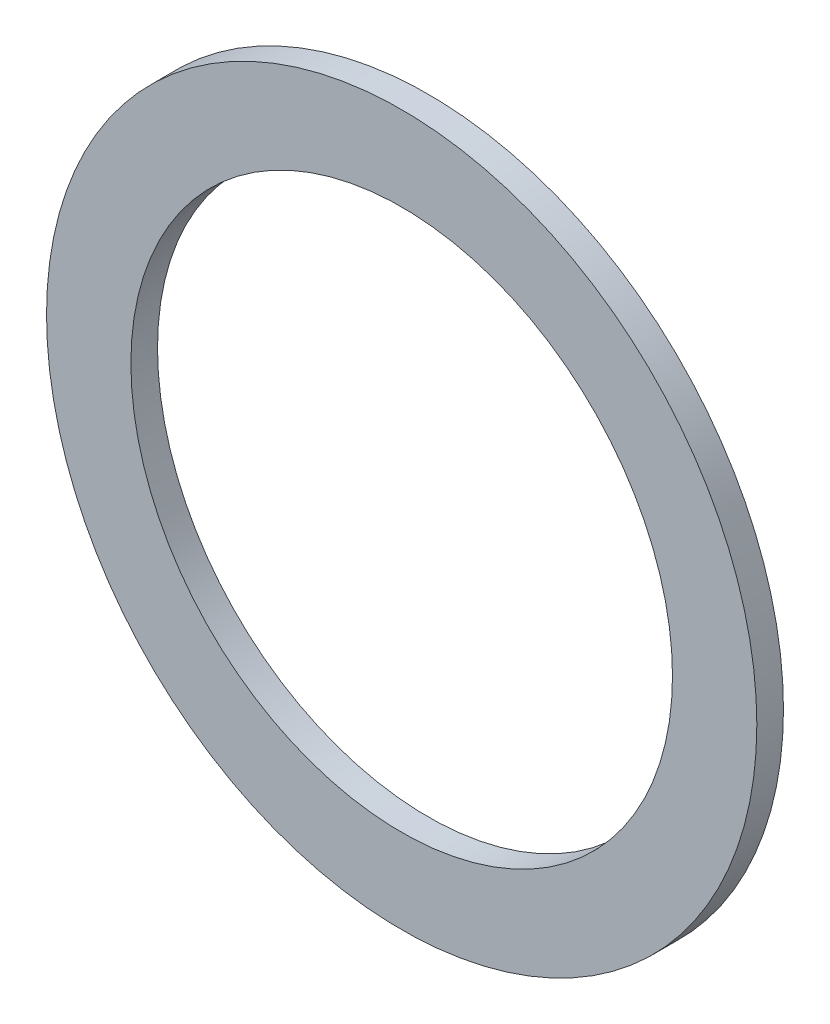
ISO-10303-21;
HEADER;
FILE_DESCRIPTION(('STEP AP214'),'2;1');
FILE_NAME('part.step','',(''),(''),'','','');
FILE_SCHEMA(('AUTOMOTIVE_DESIGN { 1 0 10303 214 1 1 1 1 }'));
ENDSEC;
DATA;
#1=APPLICATION_CONTEXT('core data for automotive mechanical design processes');
#2=APPLICATION_PROTOCOL_DEFINITION('international standard','automotive_design',2000,#1);
#3=PRODUCT_CONTEXT('',#1,'mechanical');
#4=PRODUCT('Part','Part','',(#3));
#5=PRODUCT_RELATED_PRODUCT_CATEGORY('part','',(#4));
#6=PRODUCT_DEFINITION_FORMATION('','',#4);
#7=PRODUCT_DEFINITION_CONTEXT('part definition',#1,'design');
#8=PRODUCT_DEFINITION('design','',#6,#7);
#9=PRODUCT_DEFINITION_SHAPE('','',#8);
#10=(LENGTH_UNIT() NAMED_UNIT(*) SI_UNIT(.MILLI.,.METRE.));
#11=(NAMED_UNIT(*) PLANE_ANGLE_UNIT() SI_UNIT($,.RADIAN.));
#12=(NAMED_UNIT(*) SI_UNIT($,.STERADIAN.) SOLID_ANGLE_UNIT());
#13=UNCERTAINTY_MEASURE_WITH_UNIT(LENGTH_MEASURE(1.E-05),#10,'distance_accuracy_value','');
#14=(GEOMETRIC_REPRESENTATION_CONTEXT(3) GLOBAL_UNCERTAINTY_ASSIGNED_CONTEXT((#13)) GLOBAL_UNIT_ASSIGNED_CONTEXT((#10,
#11,#12)) REPRESENTATION_CONTEXT('',''));
#15=CARTESIAN_POINT('',(0.,0.,0.));
#16=DIRECTION('',(0.,0.,1.));
#17=DIRECTION('',(1.,0.,0.));
#18=AXIS2_PLACEMENT_3D('',#15,#16,#17);
#19=CARTESIAN_POINT('',(0.,0.,1.95));
#20=DIRECTION('',(0.,0.,1.));
#21=DIRECTION('',(1.,0.,0.));
#22=AXIS2_PLACEMENT_3D('',#19,#20,#21);
#23=PLANE('',#22);
#24=CARTESIAN_POINT('',(0.,0.,1.95));
#25=DIRECTION('',(0.,0.,1.));
#26=DIRECTION('',(1.,0.,0.));
#27=AXIS2_PLACEMENT_3D('',#24,#25,#26);
#28=CIRCLE('',#27,2.);
#29=CARTESIAN_POINT('',(2.,0.,1.95));
#30=VERTEX_POINT('',#29);
#31=EDGE_CURVE('E10',#30,#30,#28,.T.);
#32=ORIENTED_EDGE('',*,*,#31,.T.);
#33=EDGE_LOOP('',(#32));
#34=FACE_BOUND('',#33,.T.);
#35=CARTESIAN_POINT('',(0.,0.,1.95));
#36=DIRECTION('',(0.,0.,1.));
#37=DIRECTION('',(1.,0.,0.));
#38=AXIS2_PLACEMENT_3D('',#35,#36,#37);
#39=CIRCLE('',#38,1.525);
#40=CARTESIAN_POINT('',(1.525,0.,1.95));
#41=VERTEX_POINT('',#40);
#42=EDGE_CURVE('E49',#41,#41,#39,.T.);
#43=ORIENTED_EDGE('',*,*,#42,.F.);
#44=EDGE_LOOP('',(#43));
#45=FACE_BOUND('',#44,.T.);
#46=ADVANCED_FACE('F39',(#34,#45),#23,.T.);
#47=CARTESIAN_POINT('',(0.,0.,1.8));
#48=DIRECTION('',(0.,0.,1.));
#49=DIRECTION('',(1.,0.,0.));
#50=AXIS2_PLACEMENT_3D('',#47,#48,#49);
#51=PLANE('',#50);
#52=CARTESIAN_POINT('',(0.,0.,1.8));
#53=DIRECTION('',(0.,0.,1.));
#54=DIRECTION('',(1.,0.,0.));
#55=AXIS2_PLACEMENT_3D('',#52,#53,#54);
#56=CIRCLE('',#55,2.);
#57=CARTESIAN_POINT('',(2.,0.,1.8));
#58=VERTEX_POINT('',#57);
#59=EDGE_CURVE('E43',#58,#58,#56,.T.);
#60=ORIENTED_EDGE('',*,*,#59,.F.);
#61=EDGE_LOOP('',(#60));
#62=FACE_BOUND('',#61,.T.);
#63=CARTESIAN_POINT('',(0.,0.,1.8));
#64=DIRECTION('',(0.,0.,1.));
#65=DIRECTION('',(1.,0.,0.));
#66=AXIS2_PLACEMENT_3D('',#63,#64,#65);
#67=CIRCLE('',#66,1.525);
#68=CARTESIAN_POINT('',(1.525,0.,1.8));
#69=VERTEX_POINT('',#68);
#70=EDGE_CURVE('E55',#69,#69,#67,.T.);
#71=ORIENTED_EDGE('',*,*,#70,.T.);
#72=EDGE_LOOP('',(#71));
#73=FACE_BOUND('',#72,.T.);
#74=ADVANCED_FACE('F62',(#62,#73),#51,.F.);
#75=CARTESIAN_POINT('',(0.,0.,1.95));
#76=DIRECTION('',(0.,0.,-1.));
#77=DIRECTION('',(-1.,0.,0.));
#78=AXIS2_PLACEMENT_3D('',#75,#76,#77);
#79=CYLINDRICAL_SURFACE('',#78,2.);
#80=ORIENTED_EDGE('',*,*,#31,.F.);
#81=EDGE_LOOP('',(#80));
#82=FACE_BOUND('',#81,.T.);
#83=ORIENTED_EDGE('',*,*,#59,.T.);
#84=EDGE_LOOP('',(#83));
#85=FACE_BOUND('',#84,.T.);
#86=ADVANCED_FACE('F41',(#82,#85),#79,.T.);
#87=CARTESIAN_POINT('',(0.,0.,1.95));
#88=DIRECTION('',(0.,0.,-1.));
#89=DIRECTION('',(-1.,0.,0.));
#90=AXIS2_PLACEMENT_3D('',#87,#88,#89);
#91=CYLINDRICAL_SURFACE('',#90,1.525);
#92=ORIENTED_EDGE('',*,*,#42,.T.);
#93=EDGE_LOOP('',(#92));
#94=FACE_BOUND('',#93,.T.);
#95=ORIENTED_EDGE('',*,*,#70,.F.);
#96=EDGE_LOOP('',(#95));
#97=FACE_BOUND('',#96,.T.);
#98=ADVANCED_FACE('F59',(#94,#97),#91,.F.);
#99=CLOSED_SHELL('',(#46,#74,#86,#98));
#100=MANIFOLD_SOLID_BREP('B2',#99);
#101=ADVANCED_BREP_SHAPE_REPRESENTATION('',(#18,#100),#14);
#102=SHAPE_DEFINITION_REPRESENTATION(#9,#101);
ENDSEC;
END-ISO-10303-21;
